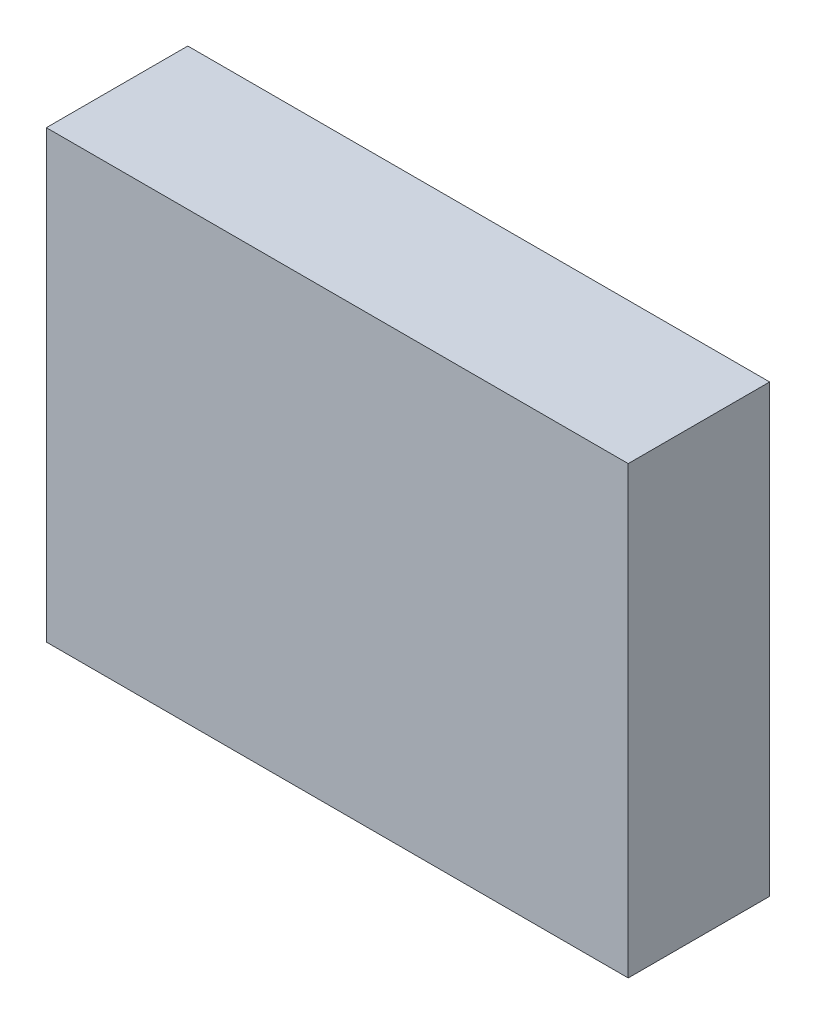
ISO-10303-21;
HEADER;
FILE_DESCRIPTION(('STEP AP214'),'2;1');
FILE_NAME('part.step','',(''),(''),'','','');
FILE_SCHEMA(('AUTOMOTIVE_DESIGN { 1 0 10303 214 1 1 1 1 }'));
ENDSEC;
DATA;
#1=APPLICATION_CONTEXT('core data for automotive mechanical design processes');
#2=APPLICATION_PROTOCOL_DEFINITION('international standard','automotive_design',2000,#1);
#3=PRODUCT_CONTEXT('',#1,'mechanical');
#4=PRODUCT('Part','Part','',(#3));
#5=PRODUCT_RELATED_PRODUCT_CATEGORY('part','',(#4));
#6=PRODUCT_DEFINITION_FORMATION('','',#4);
#7=PRODUCT_DEFINITION_CONTEXT('part definition',#1,'design');
#8=PRODUCT_DEFINITION('design','',#6,#7);
#9=PRODUCT_DEFINITION_SHAPE('','',#8);
#10=(LENGTH_UNIT() NAMED_UNIT(*) SI_UNIT(.MILLI.,.METRE.));
#11=(NAMED_UNIT(*) PLANE_ANGLE_UNIT() SI_UNIT($,.RADIAN.));
#12=(NAMED_UNIT(*) SI_UNIT($,.STERADIAN.) SOLID_ANGLE_UNIT());
#13=UNCERTAINTY_MEASURE_WITH_UNIT(LENGTH_MEASURE(1.E-05),#10,'distance_accuracy_value','');
#14=(GEOMETRIC_REPRESENTATION_CONTEXT(3) GLOBAL_UNCERTAINTY_ASSIGNED_CONTEXT((#13)) GLOBAL_UNIT_ASSIGNED_CONTEXT((#10,
#11,#12)) REPRESENTATION_CONTEXT('',''));
#15=CARTESIAN_POINT('',(0.,0.,0.));
#16=DIRECTION('',(0.,0.,1.));
#17=DIRECTION('',(1.,0.,0.));
#18=AXIS2_PLACEMENT_3D('',#15,#16,#17);
#19=CARTESIAN_POINT('',(-56.96,-43.61,27.69));
#20=DIRECTION('',(0.,1.,0.));
#21=DIRECTION('',(0.,0.,1.));
#22=AXIS2_PLACEMENT_3D('',#19,#20,#21);
#23=PLANE('',#22);
#24=DIRECTION('',(1.,0.,0.));
#25=VECTOR('',#24,1.);
#26=CARTESIAN_POINT('',(-56.96,-43.61,0.));
#27=LINE('',#26,#25);
#28=CARTESIAN_POINT('',(-56.96,-43.61,0.));
#29=VERTEX_POINT('',#28);
#30=CARTESIAN_POINT('',(56.96,-43.61,0.));
#31=VERTEX_POINT('',#30);
#32=EDGE_CURVE('E106',#29,#31,#27,.T.);
#33=ORIENTED_EDGE('',*,*,#32,.T.);
#34=DIRECTION('',(0.,0.,-1.));
#35=VECTOR('',#34,1.);
#36=CARTESIAN_POINT('',(56.96,-43.61,27.69));
#37=LINE('',#36,#35);
#38=CARTESIAN_POINT('',(56.96,-43.61,27.69));
#39=VERTEX_POINT('',#38);
#40=EDGE_CURVE('E11',#39,#31,#37,.T.);
#41=ORIENTED_EDGE('',*,*,#40,.F.);
#42=DIRECTION('',(1.,0.,0.));
#43=VECTOR('',#42,1.);
#44=CARTESIAN_POINT('',(-56.96,-43.61,27.69));
#45=LINE('',#44,#43);
#46=CARTESIAN_POINT('',(-56.96,-43.61,27.69));
#47=VERTEX_POINT('',#46);
#48=EDGE_CURVE('E92',#47,#39,#45,.T.);
#49=ORIENTED_EDGE('',*,*,#48,.F.);
#50=DIRECTION('',(0.,0.,-1.));
#51=VECTOR('',#50,1.);
#52=CARTESIAN_POINT('',(-56.96,-43.61,27.69));
#53=LINE('',#52,#51);
#54=EDGE_CURVE('E59',#47,#29,#53,.T.);
#55=ORIENTED_EDGE('',*,*,#54,.T.);
#56=EDGE_LOOP('',(#33,#41,#49,#55));
#57=FACE_BOUND('',#56,.T.);
#58=ADVANCED_FACE('F43',(#57),#23,.F.);
#59=CARTESIAN_POINT('',(56.96,-43.61,27.69));
#60=DIRECTION('',(-1.,0.,0.));
#61=DIRECTION('',(0.,0.,1.));
#62=AXIS2_PLACEMENT_3D('',#59,#60,#61);
#63=PLANE('',#62);
#64=DIRECTION('',(0.,1.,0.));
#65=VECTOR('',#64,1.);
#66=CARTESIAN_POINT('',(56.96,-43.61,0.));
#67=LINE('',#66,#65);
#68=CARTESIAN_POINT('',(56.96,43.61,0.));
#69=VERTEX_POINT('',#68);
#70=EDGE_CURVE('E97',#31,#69,#67,.T.);
#71=ORIENTED_EDGE('',*,*,#70,.T.);
#72=DIRECTION('',(0.,0.,-1.));
#73=VECTOR('',#72,1.);
#74=CARTESIAN_POINT('',(56.96,43.61,27.69));
#75=LINE('',#74,#73);
#76=CARTESIAN_POINT('',(56.96,43.61,27.69));
#77=VERTEX_POINT('',#76);
#78=EDGE_CURVE('E51',#77,#69,#75,.T.);
#79=ORIENTED_EDGE('',*,*,#78,.F.);
#80=DIRECTION('',(0.,1.,0.));
#81=VECTOR('',#80,1.);
#82=CARTESIAN_POINT('',(56.96,-43.61,27.69));
#83=LINE('',#82,#81);
#84=EDGE_CURVE('E84',#39,#77,#83,.T.);
#85=ORIENTED_EDGE('',*,*,#84,.F.);
#86=ORIENTED_EDGE('',*,*,#40,.T.);
#87=EDGE_LOOP('',(#71,#79,#85,#86));
#88=FACE_BOUND('',#87,.T.);
#89=ADVANCED_FACE('F96',(#88),#63,.F.);
#90=CARTESIAN_POINT('',(-56.96,43.61,27.69));
#91=DIRECTION('',(0.,1.,0.));
#92=DIRECTION('',(0.,0.,1.));
#93=AXIS2_PLACEMENT_3D('',#90,#91,#92);
#94=PLANE('',#93);
#95=DIRECTION('',(1.,0.,0.));
#96=VECTOR('',#95,1.);
#97=CARTESIAN_POINT('',(-56.96,43.61,0.));
#98=LINE('',#97,#96);
#99=CARTESIAN_POINT('',(-56.96,43.61,0.));
#100=VERTEX_POINT('',#99);
#101=EDGE_CURVE('E109',#100,#69,#98,.T.);
#102=ORIENTED_EDGE('',*,*,#101,.F.);
#103=DIRECTION('',(0.,0.,-1.));
#104=VECTOR('',#103,1.);
#105=CARTESIAN_POINT('',(-56.96,43.61,27.69));
#106=LINE('',#105,#104);
#107=CARTESIAN_POINT('',(-56.96,43.61,27.69));
#108=VERTEX_POINT('',#107);
#109=EDGE_CURVE('E73',#108,#100,#106,.T.);
#110=ORIENTED_EDGE('',*,*,#109,.F.);
#111=DIRECTION('',(1.,0.,0.));
#112=VECTOR('',#111,1.);
#113=CARTESIAN_POINT('',(-56.96,43.61,27.69));
#114=LINE('',#113,#112);
#115=EDGE_CURVE('E91',#108,#77,#114,.T.);
#116=ORIENTED_EDGE('',*,*,#115,.T.);
#117=ORIENTED_EDGE('',*,*,#78,.T.);
#118=EDGE_LOOP('',(#102,#110,#116,#117));
#119=FACE_BOUND('',#118,.T.);
#120=ADVANCED_FACE('F100',(#119),#94,.T.);
#121=CARTESIAN_POINT('',(-56.96,-43.61,27.69));
#122=DIRECTION('',(-1.,0.,0.));
#123=DIRECTION('',(0.,0.,1.));
#124=AXIS2_PLACEMENT_3D('',#121,#122,#123);
#125=PLANE('',#124);
#126=DIRECTION('',(0.,1.,0.));
#127=VECTOR('',#126,1.);
#128=CARTESIAN_POINT('',(-56.96,-43.61,0.));
#129=LINE('',#128,#127);
#130=EDGE_CURVE('E111',#29,#100,#129,.T.);
#131=ORIENTED_EDGE('',*,*,#130,.F.);
#132=ORIENTED_EDGE('',*,*,#54,.F.);
#133=DIRECTION('',(0.,1.,0.));
#134=VECTOR('',#133,1.);
#135=CARTESIAN_POINT('',(-56.96,-43.61,27.69));
#136=LINE('',#135,#134);
#137=EDGE_CURVE('E101',#47,#108,#136,.T.);
#138=ORIENTED_EDGE('',*,*,#137,.T.);
#139=ORIENTED_EDGE('',*,*,#109,.T.);
#140=EDGE_LOOP('',(#131,#132,#138,#139));
#141=FACE_BOUND('',#140,.T.);
#142=ADVANCED_FACE('F117',(#141),#125,.T.);
#143=CARTESIAN_POINT('',(0.,0.,27.69));
#144=DIRECTION('',(0.,0.,1.));
#145=DIRECTION('',(1.,0.,0.));
#146=AXIS2_PLACEMENT_3D('',#143,#144,#145);
#147=PLANE('',#146);
#148=ORIENTED_EDGE('',*,*,#48,.T.);
#149=ORIENTED_EDGE('',*,*,#84,.T.);
#150=ORIENTED_EDGE('',*,*,#115,.F.);
#151=ORIENTED_EDGE('',*,*,#137,.F.);
#152=EDGE_LOOP('',(#148,#149,#150,#151));
#153=FACE_BOUND('',#152,.T.);
#154=ADVANCED_FACE('F88',(#153),#147,.T.);
#155=CARTESIAN_POINT('',(0.,0.,0.));
#156=DIRECTION('',(0.,0.,1.));
#157=DIRECTION('',(1.,0.,0.));
#158=AXIS2_PLACEMENT_3D('',#155,#156,#157);
#159=PLANE('',#158);
#160=ORIENTED_EDGE('',*,*,#32,.F.);
#161=ORIENTED_EDGE('',*,*,#130,.T.);
#162=ORIENTED_EDGE('',*,*,#101,.T.);
#163=ORIENTED_EDGE('',*,*,#70,.F.);
#164=EDGE_LOOP('',(#160,#161,#162,#163));
#165=FACE_BOUND('',#164,.T.);
#166=ADVANCED_FACE('F116',(#165),#159,.F.);
#167=CLOSED_SHELL('',(#58,#89,#120,#142,#154,#166));
#168=MANIFOLD_SOLID_BREP('B2',#167);
#169=ADVANCED_BREP_SHAPE_REPRESENTATION('',(#18,#168),#14);
#170=SHAPE_DEFINITION_REPRESENTATION(#9,#169);
ENDSEC;
END-ISO-10303-21;
